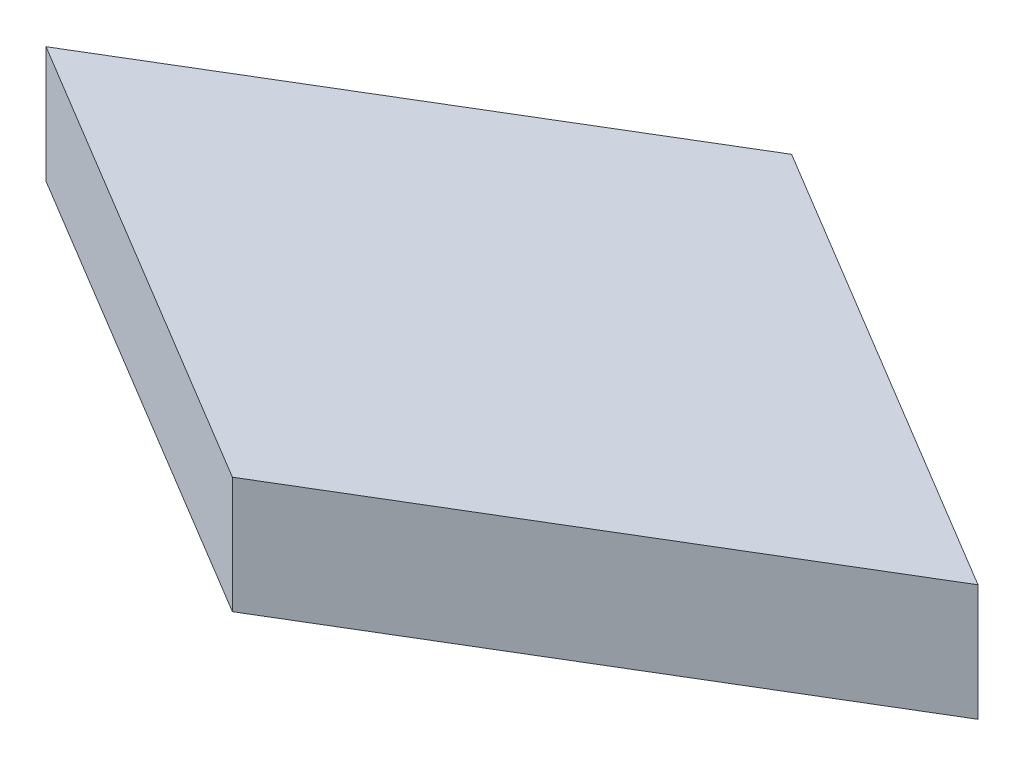
ISO-10303-21;
HEADER;
FILE_DESCRIPTION(('STEP AP214'),'2;1');
FILE_NAME('part.step','',(''),(''),'','','');
FILE_SCHEMA(('AUTOMOTIVE_DESIGN { 1 0 10303 214 1 1 1 1 }'));
ENDSEC;
DATA;
#1=APPLICATION_CONTEXT('core data for automotive mechanical design processes');
#2=APPLICATION_PROTOCOL_DEFINITION('international standard','automotive_design',2000,#1);
#3=PRODUCT_CONTEXT('',#1,'mechanical');
#4=PRODUCT('Part','Part','',(#3));
#5=PRODUCT_RELATED_PRODUCT_CATEGORY('part','',(#4));
#6=PRODUCT_DEFINITION_FORMATION('','',#4);
#7=PRODUCT_DEFINITION_CONTEXT('part definition',#1,'design');
#8=PRODUCT_DEFINITION('design','',#6,#7);
#9=PRODUCT_DEFINITION_SHAPE('','',#8);
#10=(LENGTH_UNIT() NAMED_UNIT(*) SI_UNIT(.MILLI.,.METRE.));
#11=(NAMED_UNIT(*) PLANE_ANGLE_UNIT() SI_UNIT($,.RADIAN.));
#12=(NAMED_UNIT(*) SI_UNIT($,.STERADIAN.) SOLID_ANGLE_UNIT());
#13=UNCERTAINTY_MEASURE_WITH_UNIT(LENGTH_MEASURE(1.E-05),#10,'distance_accuracy_value','');
#14=(GEOMETRIC_REPRESENTATION_CONTEXT(3) GLOBAL_UNCERTAINTY_ASSIGNED_CONTEXT((#13)) GLOBAL_UNIT_ASSIGNED_CONTEXT((#10,
#11,#12)) REPRESENTATION_CONTEXT('',''));
#15=CARTESIAN_POINT('',(0.,0.,0.));
#16=DIRECTION('',(0.,0.,1.));
#17=DIRECTION('',(1.,0.,0.));
#18=AXIS2_PLACEMENT_3D('',#15,#16,#17);
#19=CARTESIAN_POINT('',(0.,5.,-12.));
#20=DIRECTION('',(0.514495755427526,0.,0.857492925712544));
#21=DIRECTION('',(0.857492925712544,0.,-0.514495755427527));
#22=AXIS2_PLACEMENT_3D('',#19,#20,#21);
#23=PLANE('',#22);
#24=DIRECTION('',(-0.857492925712544,0.,0.514495755427527));
#25=VECTOR('',#24,1.);
#26=CARTESIAN_POINT('',(0.,0.,-12.));
#27=LINE('',#26,#25);
#28=CARTESIAN_POINT('',(0.,0.,-12.));
#29=VERTEX_POINT('',#28);
#30=CARTESIAN_POINT('',(-20.,0.,0.));
#31=VERTEX_POINT('',#30);
#32=EDGE_CURVE('E102',#29,#31,#27,.T.);
#33=ORIENTED_EDGE('',*,*,#32,.T.);
#34=DIRECTION('',(0.,-1.,0.));
#35=VECTOR('',#34,1.);
#36=CARTESIAN_POINT('',(-20.,5.,0.));
#37=LINE('',#36,#35);
#38=CARTESIAN_POINT('',(-20.,5.,0.));
#39=VERTEX_POINT('',#38);
#40=EDGE_CURVE('E11',#39,#31,#37,.T.);
#41=ORIENTED_EDGE('',*,*,#40,.F.);
#42=DIRECTION('',(-0.857492925712544,0.,0.514495755427527));
#43=VECTOR('',#42,1.);
#44=CARTESIAN_POINT('',(0.,5.,-12.));
#45=LINE('',#44,#43);
#46=CARTESIAN_POINT('',(0.,5.,-12.));
#47=VERTEX_POINT('',#46);
#48=EDGE_CURVE('E90',#47,#39,#45,.T.);
#49=ORIENTED_EDGE('',*,*,#48,.F.);
#50=DIRECTION('',(0.,-1.,0.));
#51=VECTOR('',#50,1.);
#52=CARTESIAN_POINT('',(0.,5.,-12.));
#53=LINE('',#52,#51);
#54=EDGE_CURVE('E98',#47,#29,#53,.T.);
#55=ORIENTED_EDGE('',*,*,#54,.T.);
#56=EDGE_LOOP('',(#33,#41,#49,#55));
#57=FACE_BOUND('',#56,.T.);
#58=ADVANCED_FACE('F39',(#57),#23,.F.);
#59=CARTESIAN_POINT('',(0.,5.,12.));
#60=DIRECTION('',(0.514495755427526,0.,-0.857492925712544));
#61=DIRECTION('',(-0.857492925712544,0.,-0.514495755427527));
#62=AXIS2_PLACEMENT_3D('',#59,#60,#61);
#63=PLANE('',#62);
#64=DIRECTION('',(0.857492925712544,0.,0.514495755427527));
#65=VECTOR('',#64,1.);
#66=CARTESIAN_POINT('',(0.,0.,12.));
#67=LINE('',#66,#65);
#68=CARTESIAN_POINT('',(0.,0.,12.));
#69=VERTEX_POINT('',#68);
#70=EDGE_CURVE('E94',#31,#69,#67,.T.);
#71=ORIENTED_EDGE('',*,*,#70,.T.);
#72=DIRECTION('',(0.,-1.,0.));
#73=VECTOR('',#72,1.);
#74=CARTESIAN_POINT('',(0.,5.,12.));
#75=LINE('',#74,#73);
#76=CARTESIAN_POINT('',(0.,5.,12.));
#77=VERTEX_POINT('',#76);
#78=EDGE_CURVE('E47',#77,#69,#75,.T.);
#79=ORIENTED_EDGE('',*,*,#78,.F.);
#80=DIRECTION('',(0.857492925712544,0.,0.514495755427527));
#81=VECTOR('',#80,1.);
#82=CARTESIAN_POINT('',(0.,5.,12.));
#83=LINE('',#82,#81);
#84=EDGE_CURVE('E85',#39,#77,#83,.T.);
#85=ORIENTED_EDGE('',*,*,#84,.F.);
#86=ORIENTED_EDGE('',*,*,#40,.T.);
#87=EDGE_LOOP('',(#71,#79,#85,#86));
#88=FACE_BOUND('',#87,.T.);
#89=ADVANCED_FACE('F93',(#88),#63,.F.);
#90=CARTESIAN_POINT('',(0.,5.,12.));
#91=DIRECTION('',(-0.514495755427526,0.,-0.857492925712544));
#92=DIRECTION('',(-0.857492925712544,0.,0.514495755427527));
#93=AXIS2_PLACEMENT_3D('',#90,#91,#92);
#94=PLANE('',#93);
#95=DIRECTION('',(0.857492925712544,0.,-0.514495755427527));
#96=VECTOR('',#95,1.);
#97=CARTESIAN_POINT('',(0.,0.,12.));
#98=LINE('',#97,#96);
#99=CARTESIAN_POINT('',(20.,0.,0.));
#100=VERTEX_POINT('',#99);
#101=EDGE_CURVE('E72',#69,#100,#98,.T.);
#102=ORIENTED_EDGE('',*,*,#101,.T.);
#103=DIRECTION('',(0.,-1.,0.));
#104=VECTOR('',#103,1.);
#105=CARTESIAN_POINT('',(20.,5.,0.));
#106=LINE('',#105,#104);
#107=CARTESIAN_POINT('',(20.,5.,0.));
#108=VERTEX_POINT('',#107);
#109=EDGE_CURVE('E95',#108,#100,#106,.T.);
#110=ORIENTED_EDGE('',*,*,#109,.F.);
#111=DIRECTION('',(0.857492925712544,0.,-0.514495755427527));
#112=VECTOR('',#111,1.);
#113=CARTESIAN_POINT('',(0.,5.,12.));
#114=LINE('',#113,#112);
#115=EDGE_CURVE('E88',#77,#108,#114,.T.);
#116=ORIENTED_EDGE('',*,*,#115,.F.);
#117=ORIENTED_EDGE('',*,*,#78,.T.);
#118=EDGE_LOOP('',(#102,#110,#116,#117));
#119=FACE_BOUND('',#118,.T.);
#120=ADVANCED_FACE('F96',(#119),#94,.F.);
#121=CARTESIAN_POINT('',(0.,5.,-12.));
#122=DIRECTION('',(-0.514495755427526,0.,0.857492925712544));
#123=DIRECTION('',(0.857492925712544,0.,0.514495755427527));
#124=AXIS2_PLACEMENT_3D('',#121,#122,#123);
#125=PLANE('',#124);
#126=DIRECTION('',(-0.857492925712544,0.,-0.514495755427527));
#127=VECTOR('',#126,1.);
#128=CARTESIAN_POINT('',(0.,0.,-12.));
#129=LINE('',#128,#127);
#130=EDGE_CURVE('E78',#100,#29,#129,.T.);
#131=ORIENTED_EDGE('',*,*,#130,.T.);
#132=ORIENTED_EDGE('',*,*,#54,.F.);
#133=DIRECTION('',(-0.857492925712544,0.,-0.514495755427527));
#134=VECTOR('',#133,1.);
#135=CARTESIAN_POINT('',(0.,5.,-12.));
#136=LINE('',#135,#134);
#137=EDGE_CURVE('E55',#108,#47,#136,.T.);
#138=ORIENTED_EDGE('',*,*,#137,.F.);
#139=ORIENTED_EDGE('',*,*,#109,.T.);
#140=EDGE_LOOP('',(#131,#132,#138,#139));
#141=FACE_BOUND('',#140,.T.);
#142=ADVANCED_FACE('F109',(#141),#125,.F.);
#143=CARTESIAN_POINT('',(0.,5.,0.));
#144=DIRECTION('',(0.,-1.,0.));
#145=DIRECTION('',(0.,0.,-1.));
#146=AXIS2_PLACEMENT_3D('',#143,#144,#145);
#147=PLANE('',#146);
#148=ORIENTED_EDGE('',*,*,#48,.T.);
#149=ORIENTED_EDGE('',*,*,#84,.T.);
#150=ORIENTED_EDGE('',*,*,#115,.T.);
#151=ORIENTED_EDGE('',*,*,#137,.T.);
#152=EDGE_LOOP('',(#148,#149,#150,#151));
#153=FACE_BOUND('',#152,.T.);
#154=ADVANCED_FACE('F86',(#153),#147,.F.);
#155=CARTESIAN_POINT('',(0.,0.,0.));
#156=DIRECTION('',(0.,-1.,0.));
#157=DIRECTION('',(0.,0.,-1.));
#158=AXIS2_PLACEMENT_3D('',#155,#156,#157);
#159=PLANE('',#158);
#160=ORIENTED_EDGE('',*,*,#32,.F.);
#161=ORIENTED_EDGE('',*,*,#130,.F.);
#162=ORIENTED_EDGE('',*,*,#101,.F.);
#163=ORIENTED_EDGE('',*,*,#70,.F.);
#164=EDGE_LOOP('',(#160,#161,#162,#163));
#165=FACE_BOUND('',#164,.T.);
#166=ADVANCED_FACE('F112',(#165),#159,.T.);
#167=CLOSED_SHELL('',(#58,#89,#120,#142,#154,#166));
#168=MANIFOLD_SOLID_BREP('B2',#167);
#169=ADVANCED_BREP_SHAPE_REPRESENTATION('',(#18,#168),#14);
#170=SHAPE_DEFINITION_REPRESENTATION(#9,#169);
ENDSEC;
END-ISO-10303-21;
